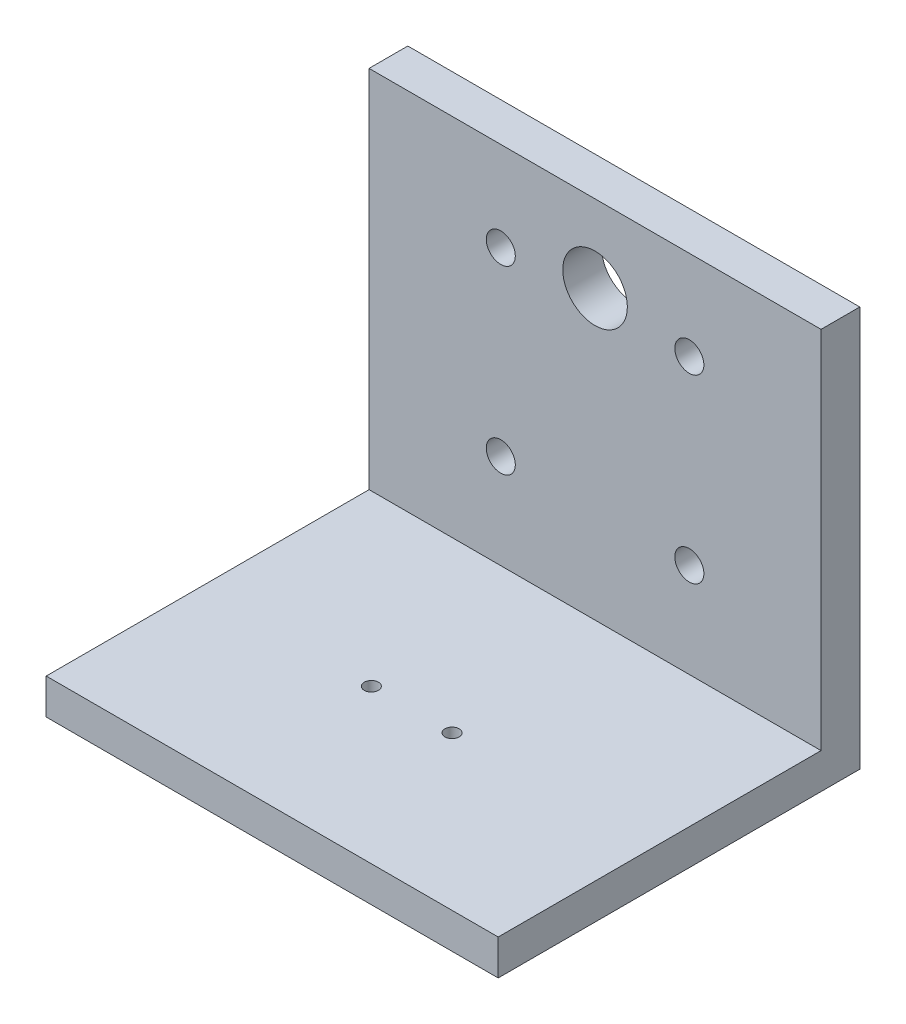
ISO-10303-21;
HEADER;
FILE_DESCRIPTION(('STEP AP214'),'2;1');
FILE_NAME('part.step','',(''),(''),'','','');
FILE_SCHEMA(('AUTOMOTIVE_DESIGN { 1 0 10303 214 1 1 1 1 }'));
ENDSEC;
DATA;
#1=APPLICATION_CONTEXT('core data for automotive mechanical design processes');
#2=APPLICATION_PROTOCOL_DEFINITION('international standard','automotive_design',2000,#1);
#3=PRODUCT_CONTEXT('',#1,'mechanical');
#4=PRODUCT('Part','Part','',(#3));
#5=PRODUCT_RELATED_PRODUCT_CATEGORY('part','',(#4));
#6=PRODUCT_DEFINITION_FORMATION('','',#4);
#7=PRODUCT_DEFINITION_CONTEXT('part definition',#1,'design');
#8=PRODUCT_DEFINITION('design','',#6,#7);
#9=PRODUCT_DEFINITION_SHAPE('','',#8);
#10=(LENGTH_UNIT() NAMED_UNIT(*) SI_UNIT(.MILLI.,.METRE.));
#11=(NAMED_UNIT(*) PLANE_ANGLE_UNIT() SI_UNIT($,.RADIAN.));
#12=(NAMED_UNIT(*) SI_UNIT($,.STERADIAN.) SOLID_ANGLE_UNIT());
#13=UNCERTAINTY_MEASURE_WITH_UNIT(LENGTH_MEASURE(1.E-05),#10,'distance_accuracy_value','');
#14=(GEOMETRIC_REPRESENTATION_CONTEXT(3) GLOBAL_UNCERTAINTY_ASSIGNED_CONTEXT((#13)) GLOBAL_UNIT_ASSIGNED_CONTEXT((#10,
#11,#12)) REPRESENTATION_CONTEXT('',''));
#15=CARTESIAN_POINT('',(0.,0.,0.));
#16=DIRECTION('',(0.,0.,1.));
#17=DIRECTION('',(1.,0.,0.));
#18=AXIS2_PLACEMENT_3D('',#15,#16,#17);
#19=CARTESIAN_POINT('',(0.,0.,6.));
#20=DIRECTION('',(0.,0.,1.));
#21=DIRECTION('',(1.,0.,0.));
#22=AXIS2_PLACEMENT_3D('',#19,#20,#21);
#23=PLANE('',#22);
#24=CARTESIAN_POINT('',(1.56358761459955,8.60283687943263,6.));
#25=DIRECTION('',(0.,0.,1.));
#26=DIRECTION('',(1.,0.,0.));
#27=AXIS2_PLACEMENT_3D('',#24,#25,#26);
#28=CIRCLE('',#27,5.);
#29=CARTESIAN_POINT('',(6.56358761459955,8.60283687943263,6.));
#30=VERTEX_POINT('',#29);
#31=EDGE_CURVE('E190',#30,#30,#28,.T.);
#32=ORIENTED_EDGE('',*,*,#31,.F.);
#33=EDGE_LOOP('',(#32));
#34=FACE_BOUND('',#33,.T.);
#35=DIRECTION('',(-1.,0.,0.));
#36=VECTOR('',#35,1.);
#37=CARTESIAN_POINT('',(-33.4364123854004,-35.8971631205674,6.));
#38=LINE('',#37,#36);
#39=CARTESIAN_POINT('',(36.5635876145996,-35.8971631205674,6.));
#40=VERTEX_POINT('',#39);
#41=CARTESIAN_POINT('',(-33.4364123854004,-35.8971631205674,6.));
#42=VERTEX_POINT('',#41);
#43=EDGE_CURVE('E50',#40,#42,#38,.T.);
#44=ORIENTED_EDGE('',*,*,#43,.F.);
#45=DIRECTION('',(0.,1.,0.));
#46=VECTOR('',#45,1.);
#47=CARTESIAN_POINT('',(36.5635876145996,20.6028368794326,6.));
#48=LINE('',#47,#46);
#49=CARTESIAN_POINT('',(36.5635876145996,20.6028368794326,6.));
#50=VERTEX_POINT('',#49);
#51=EDGE_CURVE('E112',#40,#50,#48,.T.);
#52=ORIENTED_EDGE('',*,*,#51,.T.);
#53=DIRECTION('',(-1.,0.,0.));
#54=VECTOR('',#53,1.);
#55=CARTESIAN_POINT('',(-33.4364123854005,20.6028368794326,6.));
#56=LINE('',#55,#54);
#57=CARTESIAN_POINT('',(-33.4364123854005,20.6028368794326,6.));
#58=VERTEX_POINT('',#57);
#59=EDGE_CURVE('E56',#50,#58,#56,.T.);
#60=ORIENTED_EDGE('',*,*,#59,.T.);
#61=DIRECTION('',(0.,-1.,0.));
#62=VECTOR('',#61,1.);
#63=CARTESIAN_POINT('',(-33.4364123854005,20.6028368794326,6.));
#64=LINE('',#63,#62);
#65=EDGE_CURVE('E85',#58,#42,#64,.T.);
#66=ORIENTED_EDGE('',*,*,#65,.T.);
#67=EDGE_LOOP('',(#44,#52,#60,#66));
#68=FACE_BOUND('',#67,.T.);
#69=CARTESIAN_POINT('',(-13.0364123854005,-21.2471631205674,6.));
#70=DIRECTION('',(0.,0.,1.));
#71=DIRECTION('',(1.,0.,0.));
#72=AXIS2_PLACEMENT_3D('',#69,#70,#71);
#73=CIRCLE('',#72,2.25);
#74=CARTESIAN_POINT('',(-10.7864123854005,-21.2471631205674,6.));
#75=VERTEX_POINT('',#74);
#76=EDGE_CURVE('E123',#75,#75,#73,.T.);
#77=ORIENTED_EDGE('',*,*,#76,.F.);
#78=EDGE_LOOP('',(#77));
#79=FACE_BOUND('',#78,.T.);
#80=CARTESIAN_POINT('',(-13.0364123854005,6.75283687943262,6.));
#81=DIRECTION('',(0.,0.,1.));
#82=DIRECTION('',(1.,0.,0.));
#83=AXIS2_PLACEMENT_3D('',#80,#81,#82);
#84=CIRCLE('',#83,2.25);
#85=CARTESIAN_POINT('',(-10.7864123854005,6.75283687943262,6.));
#86=VERTEX_POINT('',#85);
#87=EDGE_CURVE('E97',#86,#86,#84,.T.);
#88=ORIENTED_EDGE('',*,*,#87,.F.);
#89=EDGE_LOOP('',(#88));
#90=FACE_BOUND('',#89,.T.);
#91=CARTESIAN_POINT('',(16.1635876145996,6.75283687943262,6.));
#92=DIRECTION('',(0.,0.,1.));
#93=DIRECTION('',(1.,0.,0.));
#94=AXIS2_PLACEMENT_3D('',#91,#92,#93);
#95=CIRCLE('',#94,2.25);
#96=CARTESIAN_POINT('',(18.4135876145996,6.75283687943262,6.));
#97=VERTEX_POINT('',#96);
#98=EDGE_CURVE('E118',#97,#97,#95,.T.);
#99=ORIENTED_EDGE('',*,*,#98,.F.);
#100=EDGE_LOOP('',(#99));
#101=FACE_BOUND('',#100,.T.);
#102=CARTESIAN_POINT('',(16.1635876145996,-21.2471631205674,6.));
#103=DIRECTION('',(0.,0.,1.));
#104=DIRECTION('',(1.,0.,0.));
#105=AXIS2_PLACEMENT_3D('',#102,#103,#104);
#106=CIRCLE('',#105,2.25);
#107=CARTESIAN_POINT('',(18.4135876145996,-21.2471631205674,6.));
#108=VERTEX_POINT('',#107);
#109=EDGE_CURVE('E129',#108,#108,#106,.T.);
#110=ORIENTED_EDGE('',*,*,#109,.F.);
#111=EDGE_LOOP('',(#110));
#112=FACE_BOUND('',#111,.T.);
#113=ADVANCED_FACE('F33',(#34,#68,#79,#90,#101,#112),#23,.T.);
#114=CARTESIAN_POINT('',(0.,0.,0.));
#115=DIRECTION('',(0.,0.,1.));
#116=DIRECTION('',(1.,0.,0.));
#117=AXIS2_PLACEMENT_3D('',#114,#115,#116);
#118=PLANE('',#117);
#119=CARTESIAN_POINT('',(1.56358761459955,8.60283687943263,0.));
#120=DIRECTION('',(0.,0.,-1.));
#121=DIRECTION('',(-1.,0.,0.));
#122=AXIS2_PLACEMENT_3D('',#119,#120,#121);
#123=CIRCLE('',#122,5.);
#124=CARTESIAN_POINT('',(-3.43641238540045,8.60283687943263,0.));
#125=VERTEX_POINT('',#124);
#126=EDGE_CURVE('E195',#125,#125,#123,.T.);
#127=ORIENTED_EDGE('',*,*,#126,.F.);
#128=EDGE_LOOP('',(#127));
#129=FACE_BOUND('',#128,.T.);
#130=DIRECTION('',(0.,-1.,0.));
#131=VECTOR('',#130,1.);
#132=CARTESIAN_POINT('',(-33.4364123854005,20.6028368794326,0.));
#133=LINE('',#132,#131);
#134=CARTESIAN_POINT('',(-33.4364123854005,20.6028368794326,0.));
#135=VERTEX_POINT('',#134);
#136=CARTESIAN_POINT('',(-33.4364123854004,-41.3971631205674,0.));
#137=VERTEX_POINT('',#136);
#138=EDGE_CURVE('E91',#135,#137,#133,.T.);
#139=ORIENTED_EDGE('',*,*,#138,.F.);
#140=DIRECTION('',(-1.,0.,0.));
#141=VECTOR('',#140,1.);
#142=CARTESIAN_POINT('',(-33.4364123854005,20.6028368794326,0.));
#143=LINE('',#142,#141);
#144=CARTESIAN_POINT('',(36.5635876145996,20.6028368794326,0.));
#145=VERTEX_POINT('',#144);
#146=EDGE_CURVE('E75',#145,#135,#143,.T.);
#147=ORIENTED_EDGE('',*,*,#146,.F.);
#148=DIRECTION('',(0.,1.,0.));
#149=VECTOR('',#148,1.);
#150=CARTESIAN_POINT('',(36.5635876145996,20.6028368794326,0.));
#151=LINE('',#150,#149);
#152=CARTESIAN_POINT('',(36.5635876145996,-41.3971631205674,0.));
#153=VERTEX_POINT('',#152);
#154=EDGE_CURVE('E86',#153,#145,#151,.T.);
#155=ORIENTED_EDGE('',*,*,#154,.F.);
#156=DIRECTION('',(1.,0.,0.));
#157=VECTOR('',#156,1.);
#158=CARTESIAN_POINT('',(-33.4364123854004,-41.3971631205674,0.));
#159=LINE('',#158,#157);
#160=EDGE_CURVE('E96',#137,#153,#159,.T.);
#161=ORIENTED_EDGE('',*,*,#160,.F.);
#162=EDGE_LOOP('',(#139,#147,#155,#161));
#163=FACE_BOUND('',#162,.T.);
#164=CARTESIAN_POINT('',(-13.0364123854005,6.75283687943262,0.));
#165=DIRECTION('',(0.,0.,1.));
#166=DIRECTION('',(1.,0.,0.));
#167=AXIS2_PLACEMENT_3D('',#164,#165,#166);
#168=CIRCLE('',#167,2.25);
#169=CARTESIAN_POINT('',(-10.7864123854005,6.75283687943262,0.));
#170=VERTEX_POINT('',#169);
#171=EDGE_CURVE('E101',#170,#170,#168,.T.);
#172=ORIENTED_EDGE('',*,*,#171,.T.);
#173=EDGE_LOOP('',(#172));
#174=FACE_BOUND('',#173,.T.);
#175=CARTESIAN_POINT('',(16.1635876145996,6.75283687943262,0.));
#176=DIRECTION('',(0.,0.,1.));
#177=DIRECTION('',(1.,0.,0.));
#178=AXIS2_PLACEMENT_3D('',#175,#176,#177);
#179=CIRCLE('',#178,2.25);
#180=CARTESIAN_POINT('',(18.4135876145996,6.75283687943262,0.));
#181=VERTEX_POINT('',#180);
#182=EDGE_CURVE('E120',#181,#181,#179,.T.);
#183=ORIENTED_EDGE('',*,*,#182,.T.);
#184=EDGE_LOOP('',(#183));
#185=FACE_BOUND('',#184,.T.);
#186=CARTESIAN_POINT('',(-13.0364123854005,-21.2471631205674,0.));
#187=DIRECTION('',(0.,0.,1.));
#188=DIRECTION('',(1.,0.,0.));
#189=AXIS2_PLACEMENT_3D('',#186,#187,#188);
#190=CIRCLE('',#189,2.25);
#191=CARTESIAN_POINT('',(-10.7864123854005,-21.2471631205674,0.));
#192=VERTEX_POINT('',#191);
#193=EDGE_CURVE('E126',#192,#192,#190,.T.);
#194=ORIENTED_EDGE('',*,*,#193,.T.);
#195=EDGE_LOOP('',(#194));
#196=FACE_BOUND('',#195,.T.);
#197=CARTESIAN_POINT('',(16.1635876145996,-21.2471631205674,0.));
#198=DIRECTION('',(0.,0.,1.));
#199=DIRECTION('',(1.,0.,0.));
#200=AXIS2_PLACEMENT_3D('',#197,#198,#199);
#201=CIRCLE('',#200,2.25);
#202=CARTESIAN_POINT('',(18.4135876145996,-21.2471631205674,0.));
#203=VERTEX_POINT('',#202);
#204=EDGE_CURVE('E132',#203,#203,#201,.T.);
#205=ORIENTED_EDGE('',*,*,#204,.T.);
#206=EDGE_LOOP('',(#205));
#207=FACE_BOUND('',#206,.T.);
#208=ADVANCED_FACE('F94',(#129,#163,#174,#185,#196,#207),#118,.F.);
#209=CARTESIAN_POINT('',(-33.4364123854005,20.6028368794326,6.));
#210=DIRECTION('',(1.,0.,0.));
#211=DIRECTION('',(0.,1.,0.));
#212=AXIS2_PLACEMENT_3D('',#209,#210,#211);
#213=PLANE('',#212);
#214=ORIENTED_EDGE('',*,*,#138,.T.);
#215=DIRECTION('',(0.,0.,-1.));
#216=VECTOR('',#215,1.);
#217=CARTESIAN_POINT('',(-33.4364123854004,-41.3971631205674,6.));
#218=LINE('',#217,#216);
#219=CARTESIAN_POINT('',(-33.4364123854004,-41.3971631205674,56.));
#220=VERTEX_POINT('',#219);
#221=EDGE_CURVE('E11',#220,#137,#218,.T.);
#222=ORIENTED_EDGE('',*,*,#221,.F.);
#223=DIRECTION('',(0.,-1.,0.));
#224=VECTOR('',#223,1.);
#225=CARTESIAN_POINT('',(-33.4364123854004,-41.3971631205674,56.));
#226=LINE('',#225,#224);
#227=CARTESIAN_POINT('',(-33.4364123854004,-35.8971631205674,56.));
#228=VERTEX_POINT('',#227);
#229=EDGE_CURVE('E143',#228,#220,#226,.T.);
#230=ORIENTED_EDGE('',*,*,#229,.F.);
#231=DIRECTION('',(0.,0.,-1.));
#232=VECTOR('',#231,1.);
#233=CARTESIAN_POINT('',(-33.4364123854004,-35.8971631205674,56.));
#234=LINE('',#233,#232);
#235=EDGE_CURVE('E145',#228,#42,#234,.T.);
#236=ORIENTED_EDGE('',*,*,#235,.T.);
#237=ORIENTED_EDGE('',*,*,#65,.F.);
#238=DIRECTION('',(0.,0.,-1.));
#239=VECTOR('',#238,1.);
#240=CARTESIAN_POINT('',(-33.4364123854005,20.6028368794326,6.));
#241=LINE('',#240,#239);
#242=EDGE_CURVE('E78',#58,#135,#241,.T.);
#243=ORIENTED_EDGE('',*,*,#242,.T.);
#244=EDGE_LOOP('',(#214,#222,#230,#236,#237,#243));
#245=FACE_BOUND('',#244,.T.);
#246=ADVANCED_FACE('F35',(#245),#213,.F.);
#247=CARTESIAN_POINT('',(-33.4364123854004,-41.3971631205674,6.));
#248=DIRECTION('',(0.,1.,0.));
#249=DIRECTION('',(0.,0.,1.));
#250=AXIS2_PLACEMENT_3D('',#247,#248,#249);
#251=PLANE('',#250);
#252=CARTESIAN_POINT('',(5.61358761459956,-41.3971631205674,32.1943603594557));
#253=DIRECTION('',(0.,1.,0.));
#254=DIRECTION('',(0.,0.,1.));
#255=AXIS2_PLACEMENT_3D('',#252,#253,#254);
#256=CIRCLE('',#255,1.1);
#257=CARTESIAN_POINT('',(5.61358761459956,-41.3971631205674,33.2943603594557));
#258=VERTEX_POINT('',#257);
#259=EDGE_CURVE('E184',#258,#258,#256,.T.);
#260=ORIENTED_EDGE('',*,*,#259,.T.);
#261=EDGE_LOOP('',(#260));
#262=FACE_BOUND('',#261,.T.);
#263=CARTESIAN_POINT('',(-6.88641238540045,-41.3971631205674,32.1943603594557));
#264=DIRECTION('',(0.,1.,0.));
#265=DIRECTION('',(0.,0.,1.));
#266=AXIS2_PLACEMENT_3D('',#263,#264,#265);
#267=CIRCLE('',#266,1.1);
#268=CARTESIAN_POINT('',(-6.88641238540045,-41.3971631205674,33.2943603594557));
#269=VERTEX_POINT('',#268);
#270=EDGE_CURVE('E144',#269,#269,#267,.T.);
#271=ORIENTED_EDGE('',*,*,#270,.T.);
#272=EDGE_LOOP('',(#271));
#273=FACE_BOUND('',#272,.T.);
#274=ORIENTED_EDGE('',*,*,#160,.T.);
#275=DIRECTION('',(0.,0.,-1.));
#276=VECTOR('',#275,1.);
#277=CARTESIAN_POINT('',(36.5635876145996,-41.3971631205674,6.));
#278=LINE('',#277,#276);
#279=CARTESIAN_POINT('',(36.5635876145996,-41.3971631205674,56.));
#280=VERTEX_POINT('',#279);
#281=EDGE_CURVE('E42',#280,#153,#278,.T.);
#282=ORIENTED_EDGE('',*,*,#281,.F.);
#283=DIRECTION('',(1.,0.,0.));
#284=VECTOR('',#283,1.);
#285=CARTESIAN_POINT('',(-33.4364123854004,-41.3971631205674,56.));
#286=LINE('',#285,#284);
#287=EDGE_CURVE('E175',#220,#280,#286,.T.);
#288=ORIENTED_EDGE('',*,*,#287,.F.);
#289=ORIENTED_EDGE('',*,*,#221,.T.);
#290=EDGE_LOOP('',(#274,#282,#288,#289));
#291=FACE_BOUND('',#290,.T.);
#292=ADVANCED_FACE('F176',(#262,#273,#291),#251,.F.);
#293=CARTESIAN_POINT('',(36.5635876145996,20.6028368794326,6.));
#294=DIRECTION('',(-1.,0.,0.));
#295=DIRECTION('',(0.,0.,1.));
#296=AXIS2_PLACEMENT_3D('',#293,#294,#295);
#297=PLANE('',#296);
#298=ORIENTED_EDGE('',*,*,#154,.T.);
#299=DIRECTION('',(0.,0.,-1.));
#300=VECTOR('',#299,1.);
#301=CARTESIAN_POINT('',(36.5635876145996,20.6028368794326,6.));
#302=LINE('',#301,#300);
#303=EDGE_CURVE('E81',#50,#145,#302,.T.);
#304=ORIENTED_EDGE('',*,*,#303,.F.);
#305=ORIENTED_EDGE('',*,*,#51,.F.);
#306=DIRECTION('',(0.,0.,-1.));
#307=VECTOR('',#306,1.);
#308=CARTESIAN_POINT('',(36.5635876145996,-35.8971631205674,56.));
#309=LINE('',#308,#307);
#310=CARTESIAN_POINT('',(36.5635876145996,-35.8971631205674,56.));
#311=VERTEX_POINT('',#310);
#312=EDGE_CURVE('E135',#311,#40,#309,.T.);
#313=ORIENTED_EDGE('',*,*,#312,.F.);
#314=DIRECTION('',(0.,1.,0.));
#315=VECTOR('',#314,1.);
#316=CARTESIAN_POINT('',(36.5635876145996,-41.3971631205674,56.));
#317=LINE('',#316,#315);
#318=EDGE_CURVE('E162',#280,#311,#317,.T.);
#319=ORIENTED_EDGE('',*,*,#318,.F.);
#320=ORIENTED_EDGE('',*,*,#281,.T.);
#321=EDGE_LOOP('',(#298,#304,#305,#313,#319,#320));
#322=FACE_BOUND('',#321,.T.);
#323=ADVANCED_FACE('F159',(#322),#297,.F.);
#324=CARTESIAN_POINT('',(-33.4364123854005,20.6028368794326,6.));
#325=DIRECTION('',(0.,-1.,0.));
#326=DIRECTION('',(0.,0.,-1.));
#327=AXIS2_PLACEMENT_3D('',#324,#325,#326);
#328=PLANE('',#327);
#329=ORIENTED_EDGE('',*,*,#146,.T.);
#330=ORIENTED_EDGE('',*,*,#242,.F.);
#331=ORIENTED_EDGE('',*,*,#59,.F.);
#332=ORIENTED_EDGE('',*,*,#303,.T.);
#333=EDGE_LOOP('',(#329,#330,#331,#332));
#334=FACE_BOUND('',#333,.T.);
#335=ADVANCED_FACE('F77',(#334),#328,.F.);
#336=CARTESIAN_POINT('',(-13.0364123854005,6.75283687943262,6.));
#337=DIRECTION('',(0.,0.,-1.));
#338=DIRECTION('',(-1.,0.,0.));
#339=AXIS2_PLACEMENT_3D('',#336,#337,#338);
#340=CYLINDRICAL_SURFACE('',#339,2.25);
#341=ORIENTED_EDGE('',*,*,#87,.T.);
#342=EDGE_LOOP('',(#341));
#343=FACE_BOUND('',#342,.T.);
#344=ORIENTED_EDGE('',*,*,#171,.F.);
#345=EDGE_LOOP('',(#344));
#346=FACE_BOUND('',#345,.T.);
#347=ADVANCED_FACE('F213',(#343,#346),#340,.F.);
#348=CARTESIAN_POINT('',(16.1635876145996,6.75283687943262,6.));
#349=DIRECTION('',(0.,0.,-1.));
#350=DIRECTION('',(-1.,0.,0.));
#351=AXIS2_PLACEMENT_3D('',#348,#349,#350);
#352=CYLINDRICAL_SURFACE('',#351,2.25);
#353=ORIENTED_EDGE('',*,*,#98,.T.);
#354=EDGE_LOOP('',(#353));
#355=FACE_BOUND('',#354,.T.);
#356=ORIENTED_EDGE('',*,*,#182,.F.);
#357=EDGE_LOOP('',(#356));
#358=FACE_BOUND('',#357,.T.);
#359=ADVANCED_FACE('F246',(#355,#358),#352,.F.);
#360=CARTESIAN_POINT('',(-13.0364123854005,-21.2471631205674,6.));
#361=DIRECTION('',(0.,0.,-1.));
#362=DIRECTION('',(-1.,0.,0.));
#363=AXIS2_PLACEMENT_3D('',#360,#361,#362);
#364=CYLINDRICAL_SURFACE('',#363,2.25);
#365=ORIENTED_EDGE('',*,*,#76,.T.);
#366=EDGE_LOOP('',(#365));
#367=FACE_BOUND('',#366,.T.);
#368=ORIENTED_EDGE('',*,*,#193,.F.);
#369=EDGE_LOOP('',(#368));
#370=FACE_BOUND('',#369,.T.);
#371=ADVANCED_FACE('F239',(#367,#370),#364,.F.);
#372=CARTESIAN_POINT('',(16.1635876145996,-21.2471631205674,6.));
#373=DIRECTION('',(0.,0.,-1.));
#374=DIRECTION('',(-1.,0.,0.));
#375=AXIS2_PLACEMENT_3D('',#372,#373,#374);
#376=CYLINDRICAL_SURFACE('',#375,2.25);
#377=ORIENTED_EDGE('',*,*,#109,.T.);
#378=EDGE_LOOP('',(#377));
#379=FACE_BOUND('',#378,.T.);
#380=ORIENTED_EDGE('',*,*,#204,.F.);
#381=EDGE_LOOP('',(#380));
#382=FACE_BOUND('',#381,.T.);
#383=ADVANCED_FACE('F231',(#379,#382),#376,.F.);
#384=CARTESIAN_POINT('',(-33.4364123854004,-35.8971631205674,56.));
#385=DIRECTION('',(0.,-1.,0.));
#386=DIRECTION('',(0.,0.,-1.));
#387=AXIS2_PLACEMENT_3D('',#384,#385,#386);
#388=PLANE('',#387);
#389=CARTESIAN_POINT('',(5.61358761459956,-35.8971631205674,32.1943603594557));
#390=DIRECTION('',(0.,1.,0.));
#391=DIRECTION('',(0.,0.,1.));
#392=AXIS2_PLACEMENT_3D('',#389,#390,#391);
#393=CIRCLE('',#392,1.1);
#394=CARTESIAN_POINT('',(5.61358761459956,-35.8971631205674,33.2943603594557));
#395=VERTEX_POINT('',#394);
#396=EDGE_CURVE('E187',#395,#395,#393,.T.);
#397=ORIENTED_EDGE('',*,*,#396,.F.);
#398=EDGE_LOOP('',(#397));
#399=FACE_BOUND('',#398,.T.);
#400=CARTESIAN_POINT('',(-6.88641238540045,-35.8971631205674,32.1943603594557));
#401=DIRECTION('',(0.,1.,0.));
#402=DIRECTION('',(0.,0.,1.));
#403=AXIS2_PLACEMENT_3D('',#400,#401,#402);
#404=CIRCLE('',#403,1.1);
#405=CARTESIAN_POINT('',(-6.88641238540045,-35.8971631205674,33.2943603594557));
#406=VERTEX_POINT('',#405);
#407=EDGE_CURVE('E181',#406,#406,#404,.T.);
#408=ORIENTED_EDGE('',*,*,#407,.F.);
#409=EDGE_LOOP('',(#408));
#410=FACE_BOUND('',#409,.T.);
#411=ORIENTED_EDGE('',*,*,#43,.T.);
#412=ORIENTED_EDGE('',*,*,#235,.F.);
#413=DIRECTION('',(-1.,0.,0.));
#414=VECTOR('',#413,1.);
#415=CARTESIAN_POINT('',(-33.4364123854004,-35.8971631205674,56.));
#416=LINE('',#415,#414);
#417=EDGE_CURVE('E140',#311,#228,#416,.T.);
#418=ORIENTED_EDGE('',*,*,#417,.F.);
#419=ORIENTED_EDGE('',*,*,#312,.T.);
#420=EDGE_LOOP('',(#411,#412,#418,#419));
#421=FACE_BOUND('',#420,.T.);
#422=ADVANCED_FACE('F152',(#399,#410,#421),#388,.F.);
#423=CARTESIAN_POINT('',(0.,0.,56.));
#424=DIRECTION('',(0.,0.,-1.));
#425=DIRECTION('',(-1.,0.,0.));
#426=AXIS2_PLACEMENT_3D('',#423,#424,#425);
#427=PLANE('',#426);
#428=ORIENTED_EDGE('',*,*,#229,.T.);
#429=ORIENTED_EDGE('',*,*,#287,.T.);
#430=ORIENTED_EDGE('',*,*,#318,.T.);
#431=ORIENTED_EDGE('',*,*,#417,.T.);
#432=EDGE_LOOP('',(#428,#429,#430,#431));
#433=FACE_BOUND('',#432,.T.);
#434=ADVANCED_FACE('F178',(#433),#427,.F.);
#435=CARTESIAN_POINT('',(-6.88641238540045,-41.3971631205674,32.1943603594557));
#436=DIRECTION('',(0.,1.,0.));
#437=DIRECTION('',(0.,0.,1.));
#438=AXIS2_PLACEMENT_3D('',#435,#436,#437);
#439=CYLINDRICAL_SURFACE('',#438,1.1);
#440=ORIENTED_EDGE('',*,*,#270,.F.);
#441=EDGE_LOOP('',(#440));
#442=FACE_BOUND('',#441,.T.);
#443=ORIENTED_EDGE('',*,*,#407,.T.);
#444=EDGE_LOOP('',(#443));
#445=FACE_BOUND('',#444,.T.);
#446=ADVANCED_FACE('F223',(#442,#445),#439,.F.);
#447=CARTESIAN_POINT('',(5.61358761459956,-41.3971631205674,32.1943603594557));
#448=DIRECTION('',(0.,1.,0.));
#449=DIRECTION('',(0.,0.,1.));
#450=AXIS2_PLACEMENT_3D('',#447,#448,#449);
#451=CYLINDRICAL_SURFACE('',#450,1.1);
#452=ORIENTED_EDGE('',*,*,#259,.F.);
#453=EDGE_LOOP('',(#452));
#454=FACE_BOUND('',#453,.T.);
#455=ORIENTED_EDGE('',*,*,#396,.T.);
#456=EDGE_LOOP('',(#455));
#457=FACE_BOUND('',#456,.T.);
#458=ADVANCED_FACE('F226',(#454,#457),#451,.F.);
#459=CARTESIAN_POINT('',(1.56358761459955,8.60283687943263,50.));
#460=DIRECTION('',(0.,0.,-1.));
#461=DIRECTION('',(-1.,0.,0.));
#462=AXIS2_PLACEMENT_3D('',#459,#460,#461);
#463=CYLINDRICAL_SURFACE('',#462,5.);
#464=ORIENTED_EDGE('',*,*,#31,.T.);
#465=EDGE_LOOP('',(#464));
#466=FACE_BOUND('',#465,.T.);
#467=ORIENTED_EDGE('',*,*,#126,.T.);
#468=EDGE_LOOP('',(#467));
#469=FACE_BOUND('',#468,.T.);
#470=ADVANCED_FACE('F199',(#466,#469),#463,.F.);
#471=CLOSED_SHELL('',(#113,#208,#246,#292,#323,#335,#347,#359,#371,#383,#422,#434,#446,#458,#470));
#472=MANIFOLD_SOLID_BREP('B2',#471);
#473=ADVANCED_BREP_SHAPE_REPRESENTATION('',(#18,#472),#14);
#474=SHAPE_DEFINITION_REPRESENTATION(#9,#473);
ENDSEC;
END-ISO-10303-21;
